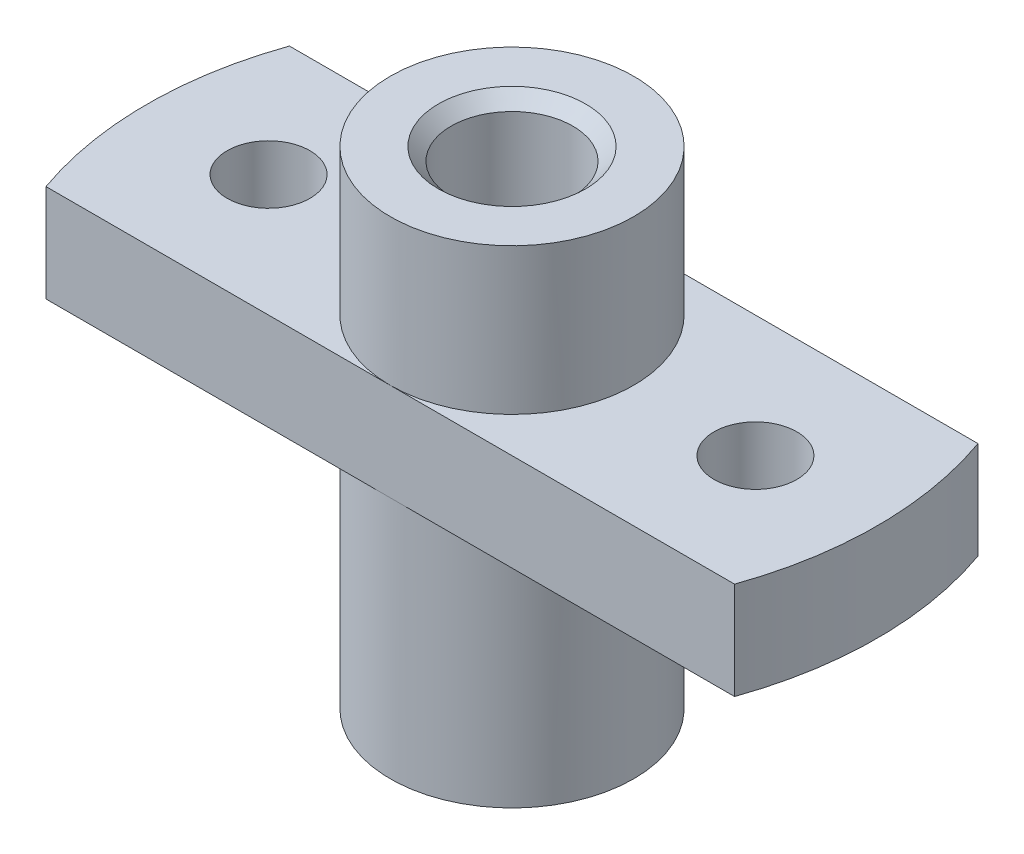
ISO-10303-21;
HEADER;
FILE_DESCRIPTION(('STEP AP214'),'2;1');
FILE_NAME('part.step','',(''),(''),'','','');
FILE_SCHEMA(('AUTOMOTIVE_DESIGN { 1 0 10303 214 1 1 1 1 }'));
ENDSEC;
DATA;
#1=APPLICATION_CONTEXT('core data for automotive mechanical design processes');
#2=APPLICATION_PROTOCOL_DEFINITION('international standard','automotive_design',2000,#1);
#3=PRODUCT_CONTEXT('',#1,'mechanical');
#4=PRODUCT('Part','Part','',(#3));
#5=PRODUCT_RELATED_PRODUCT_CATEGORY('part','',(#4));
#6=PRODUCT_DEFINITION_FORMATION('','',#4);
#7=PRODUCT_DEFINITION_CONTEXT('part definition',#1,'design');
#8=PRODUCT_DEFINITION('design','',#6,#7);
#9=PRODUCT_DEFINITION_SHAPE('','',#8);
#10=(LENGTH_UNIT() NAMED_UNIT(*) SI_UNIT(.MILLI.,.METRE.));
#11=(NAMED_UNIT(*) PLANE_ANGLE_UNIT() SI_UNIT($,.RADIAN.));
#12=(NAMED_UNIT(*) SI_UNIT($,.STERADIAN.) SOLID_ANGLE_UNIT());
#13=UNCERTAINTY_MEASURE_WITH_UNIT(LENGTH_MEASURE(1.E-05),#10,'distance_accuracy_value','');
#14=(GEOMETRIC_REPRESENTATION_CONTEXT(3) GLOBAL_UNCERTAINTY_ASSIGNED_CONTEXT((#13)) GLOBAL_UNIT_ASSIGNED_CONTEXT((#10,
#11,#12)) REPRESENTATION_CONTEXT('',''));
#15=CARTESIAN_POINT('',(0.,0.,0.));
#16=DIRECTION('',(0.,0.,1.));
#17=DIRECTION('',(1.,0.,0.));
#18=AXIS2_PLACEMENT_3D('',#15,#16,#17);
#19=CARTESIAN_POINT('',(-5.,10.,0.));
#20=DIRECTION('',(0.,-1.,0.));
#21=DIRECTION('',(1.,0.,0.));
#22=AXIS2_PLACEMENT_3D('',#19,#20,#21);
#23=PLANE('',#22);
#24=CARTESIAN_POINT('',(10.,10.,0.));
#25=DIRECTION('',(0.,-1.,0.));
#26=DIRECTION('',(1.,0.,0.));
#27=AXIS2_PLACEMENT_3D('',#24,#25,#26);
#28=CIRCLE('',#27,1.69999999999999);
#29=CARTESIAN_POINT('',(11.7,10.,0.));
#30=VERTEX_POINT('',#29);
#31=EDGE_CURVE('E290',#30,#30,#28,.T.);
#32=ORIENTED_EDGE('',*,*,#31,.F.);
#33=EDGE_LOOP('',(#32));
#34=FACE_BOUND('',#33,.T.);
#35=CARTESIAN_POINT('',(0.,10.,0.));
#36=DIRECTION('',(0.,1.,0.));
#37=DIRECTION('',(-1.,0.,0.));
#38=AXIS2_PLACEMENT_3D('',#35,#36,#37);
#39=CIRCLE('',#38,15.);
#40=CARTESIAN_POINT('',(14.142135623731,10.,5.));
#41=VERTEX_POINT('',#40);
#42=CARTESIAN_POINT('',(14.1421356237309,10.,-5.));
#43=VERTEX_POINT('',#42);
#44=EDGE_CURVE('E104',#41,#43,#39,.T.);
#45=ORIENTED_EDGE('',*,*,#44,.F.);
#46=DIRECTION('',(-1.,0.,0.));
#47=VECTOR('',#46,1.);
#48=CARTESIAN_POINT('',(-5.,10.,5.));
#49=LINE('',#48,#47);
#50=CARTESIAN_POINT('',(0.,10.,5.));
#51=VERTEX_POINT('',#50);
#52=EDGE_CURVE('E316',#41,#51,#49,.T.);
#53=ORIENTED_EDGE('',*,*,#52,.T.);
#54=CARTESIAN_POINT('',(0.,10.,0.));
#55=DIRECTION('',(0.,1.,0.));
#56=DIRECTION('',(-1.,0.,0.));
#57=AXIS2_PLACEMENT_3D('',#54,#55,#56);
#58=CIRCLE('',#57,5.);
#59=CARTESIAN_POINT('',(0.,10.,-5.));
#60=VERTEX_POINT('',#59);
#61=EDGE_CURVE('E40',#51,#60,#58,.T.);
#62=ORIENTED_EDGE('',*,*,#61,.T.);
#63=DIRECTION('',(1.,0.,0.));
#64=VECTOR('',#63,1.);
#65=CARTESIAN_POINT('',(-5.,10.,-5.));
#66=LINE('',#65,#64);
#67=EDGE_CURVE('E319',#60,#43,#66,.T.);
#68=ORIENTED_EDGE('',*,*,#67,.T.);
#69=EDGE_LOOP('',(#45,#53,#62,#68));
#70=FACE_BOUND('',#69,.T.);
#71=ADVANCED_FACE('F32',(#34,#70),#23,.T.);
#72=CARTESIAN_POINT('',(-10.,10.,0.));
#73=DIRECTION('',(0.,-1.,0.));
#74=DIRECTION('',(1.,0.,0.));
#75=AXIS2_PLACEMENT_3D('',#72,#73,#74);
#76=CIRCLE('',#75,1.69999999999999);
#77=CARTESIAN_POINT('',(-8.30000000000001,10.,0.));
#78=VERTEX_POINT('',#77);
#79=EDGE_CURVE('E297',#78,#78,#76,.T.);
#80=ORIENTED_EDGE('',*,*,#79,.F.);
#81=EDGE_LOOP('',(#80));
#82=FACE_BOUND('',#81,.T.);
#83=EDGE_CURVE('E111',#60,#51,#58,.T.);
#84=ORIENTED_EDGE('',*,*,#83,.T.);
#85=CARTESIAN_POINT('',(-14.1421356237309,10.,5.));
#86=VERTEX_POINT('',#85);
#87=EDGE_CURVE('E98',#51,#86,#49,.T.);
#88=ORIENTED_EDGE('',*,*,#87,.T.);
#89=CARTESIAN_POINT('',(-14.142135623731,10.,-5.));
#90=VERTEX_POINT('',#89);
#91=EDGE_CURVE('E97',#90,#86,#39,.T.);
#92=ORIENTED_EDGE('',*,*,#91,.F.);
#93=EDGE_CURVE('E123',#90,#60,#66,.T.);
#94=ORIENTED_EDGE('',*,*,#93,.T.);
#95=EDGE_LOOP('',(#84,#88,#92,#94));
#96=FACE_BOUND('',#95,.T.);
#97=ADVANCED_FACE('F121',(#82,#96),#23,.T.);
#98=CARTESIAN_POINT('',(0.,20.,0.));
#99=DIRECTION('',(0.,1.,0.));
#100=DIRECTION('',(-1.,0.,0.));
#101=AXIS2_PLACEMENT_3D('',#98,#99,#100);
#102=CYLINDRICAL_SURFACE('',#101,15.);
#103=ORIENTED_EDGE('',*,*,#44,.T.);
#104=DIRECTION('',(0.,1.,0.));
#105=VECTOR('',#104,1.);
#106=CARTESIAN_POINT('',(14.1421356237309,20.,-5.));
#107=LINE('',#106,#105);
#108=CARTESIAN_POINT('',(14.142135623731,14.,-5.));
#109=VERTEX_POINT('',#108);
#110=EDGE_CURVE('E93',#43,#109,#107,.T.);
#111=ORIENTED_EDGE('',*,*,#110,.T.);
#112=CARTESIAN_POINT('',(0.,14.,0.));
#113=DIRECTION('',(0.,1.,0.));
#114=DIRECTION('',(-1.,0.,0.));
#115=AXIS2_PLACEMENT_3D('',#112,#113,#114);
#116=CIRCLE('',#115,15.);
#117=CARTESIAN_POINT('',(14.142135623731,14.,5.));
#118=VERTEX_POINT('',#117);
#119=EDGE_CURVE('E105',#118,#109,#116,.T.);
#120=ORIENTED_EDGE('',*,*,#119,.F.);
#121=DIRECTION('',(0.,1.,0.));
#122=VECTOR('',#121,1.);
#123=CARTESIAN_POINT('',(14.1421356237309,20.,5.));
#124=LINE('',#123,#122);
#125=EDGE_CURVE('E55',#118,#41,#124,.F.);
#126=ORIENTED_EDGE('',*,*,#125,.T.);
#127=EDGE_LOOP('',(#103,#111,#120,#126));
#128=FACE_BOUND('',#127,.T.);
#129=ADVANCED_FACE('F145',(#128),#102,.T.);
#130=DIRECTION('',(0.,1.,0.));
#131=VECTOR('',#130,1.);
#132=CARTESIAN_POINT('',(-14.1421356237309,20.,-5.));
#133=LINE('',#132,#131);
#134=CARTESIAN_POINT('',(-14.142135623731,14.,-5.));
#135=VERTEX_POINT('',#134);
#136=EDGE_CURVE('E99',#135,#90,#133,.F.);
#137=ORIENTED_EDGE('',*,*,#136,.T.);
#138=ORIENTED_EDGE('',*,*,#91,.T.);
#139=DIRECTION('',(0.,1.,0.));
#140=VECTOR('',#139,1.);
#141=CARTESIAN_POINT('',(-14.1421356237309,20.,5.));
#142=LINE('',#141,#140);
#143=CARTESIAN_POINT('',(-14.142135623731,14.,5.));
#144=VERTEX_POINT('',#143);
#145=EDGE_CURVE('E87',#86,#144,#142,.T.);
#146=ORIENTED_EDGE('',*,*,#145,.T.);
#147=EDGE_CURVE('E47',#135,#144,#116,.T.);
#148=ORIENTED_EDGE('',*,*,#147,.F.);
#149=EDGE_LOOP('',(#137,#138,#146,#148));
#150=FACE_BOUND('',#149,.T.);
#151=ADVANCED_FACE('F96',(#150),#102,.T.);
#152=CARTESIAN_POINT('',(-15.,14.,0.));
#153=DIRECTION('',(0.,1.,0.));
#154=DIRECTION('',(-1.,0.,0.));
#155=AXIS2_PLACEMENT_3D('',#152,#153,#154);
#156=PLANE('',#155);
#157=CARTESIAN_POINT('',(-10.,14.,0.));
#158=DIRECTION('',(0.,1.,0.));
#159=DIRECTION('',(0.,0.,1.));
#160=AXIS2_PLACEMENT_3D('',#157,#158,#159);
#161=CIRCLE('',#160,1.69999999999999);
#162=CARTESIAN_POINT('',(-10.,14.,1.69999999999999));
#163=VERTEX_POINT('',#162);
#164=EDGE_CURVE('E300',#163,#163,#161,.T.);
#165=ORIENTED_EDGE('',*,*,#164,.F.);
#166=EDGE_LOOP('',(#165));
#167=FACE_BOUND('',#166,.T.);
#168=ORIENTED_EDGE('',*,*,#147,.T.);
#169=DIRECTION('',(1.,0.,0.));
#170=VECTOR('',#169,1.);
#171=CARTESIAN_POINT('',(-15.,14.,5.));
#172=LINE('',#171,#170);
#173=CARTESIAN_POINT('',(0.,14.,5.));
#174=VERTEX_POINT('',#173);
#175=EDGE_CURVE('E85',#144,#174,#172,.T.);
#176=ORIENTED_EDGE('',*,*,#175,.T.);
#177=CARTESIAN_POINT('',(0.,14.,0.));
#178=DIRECTION('',(0.,1.,0.));
#179=DIRECTION('',(-1.,0.,0.));
#180=AXIS2_PLACEMENT_3D('',#177,#178,#179);
#181=CIRCLE('',#180,5.);
#182=CARTESIAN_POINT('',(0.,14.,-5.));
#183=VERTEX_POINT('',#182);
#184=EDGE_CURVE('E287',#183,#174,#181,.T.);
#185=ORIENTED_EDGE('',*,*,#184,.F.);
#186=DIRECTION('',(-1.,0.,0.));
#187=VECTOR('',#186,1.);
#188=CARTESIAN_POINT('',(-15.,14.,-5.));
#189=LINE('',#188,#187);
#190=EDGE_CURVE('E103',#183,#135,#189,.T.);
#191=ORIENTED_EDGE('',*,*,#190,.T.);
#192=EDGE_LOOP('',(#168,#176,#185,#191));
#193=FACE_BOUND('',#192,.T.);
#194=ADVANCED_FACE('F102',(#167,#193),#156,.T.);
#195=CARTESIAN_POINT('',(10.,14.,0.));
#196=DIRECTION('',(0.,1.,0.));
#197=DIRECTION('',(0.,0.,1.));
#198=AXIS2_PLACEMENT_3D('',#195,#196,#197);
#199=CIRCLE('',#198,1.69999999999999);
#200=CARTESIAN_POINT('',(10.,14.,1.69999999999999));
#201=VERTEX_POINT('',#200);
#202=EDGE_CURVE('E280',#201,#201,#199,.T.);
#203=ORIENTED_EDGE('',*,*,#202,.F.);
#204=EDGE_LOOP('',(#203));
#205=FACE_BOUND('',#204,.T.);
#206=EDGE_CURVE('E108',#174,#183,#181,.T.);
#207=ORIENTED_EDGE('',*,*,#206,.F.);
#208=EDGE_CURVE('E89',#174,#118,#172,.T.);
#209=ORIENTED_EDGE('',*,*,#208,.T.);
#210=ORIENTED_EDGE('',*,*,#119,.T.);
#211=EDGE_CURVE('E286',#109,#183,#189,.T.);
#212=ORIENTED_EDGE('',*,*,#211,.T.);
#213=EDGE_LOOP('',(#207,#209,#210,#212));
#214=FACE_BOUND('',#213,.T.);
#215=ADVANCED_FACE('F136',(#205,#214),#156,.T.);
#216=CARTESIAN_POINT('',(0.,0.,0.));
#217=DIRECTION('',(0.,-1.,0.));
#218=DIRECTION('',(1.,0.,0.));
#219=AXIS2_PLACEMENT_3D('',#216,#217,#218);
#220=PLANE('',#219);
#221=CARTESIAN_POINT('',(0.,0.,0.));
#222=DIRECTION('',(0.,1.,0.));
#223=DIRECTION('',(0.,0.,1.));
#224=AXIS2_PLACEMENT_3D('',#221,#222,#223);
#225=CIRCLE('',#224,3.025);
#226=CARTESIAN_POINT('',(0.,0.,3.025));
#227=VERTEX_POINT('',#226);
#228=EDGE_CURVE('E312',#227,#227,#225,.T.);
#229=ORIENTED_EDGE('',*,*,#228,.T.);
#230=EDGE_LOOP('',(#229));
#231=FACE_BOUND('',#230,.T.);
#232=CARTESIAN_POINT('',(0.,0.,0.));
#233=DIRECTION('',(0.,1.,0.));
#234=DIRECTION('',(-1.,0.,0.));
#235=AXIS2_PLACEMENT_3D('',#232,#233,#234);
#236=CIRCLE('',#235,5.);
#237=CARTESIAN_POINT('',(-5.,0.,0.));
#238=VERTEX_POINT('',#237);
#239=EDGE_CURVE('E12',#238,#238,#236,.T.);
#240=ORIENTED_EDGE('',*,*,#239,.F.);
#241=EDGE_LOOP('',(#240));
#242=FACE_BOUND('',#241,.T.);
#243=ADVANCED_FACE('F34',(#231,#242),#220,.T.);
#244=CARTESIAN_POINT('',(0.,20.,0.));
#245=DIRECTION('',(0.,1.,0.));
#246=DIRECTION('',(-1.,0.,0.));
#247=AXIS2_PLACEMENT_3D('',#244,#245,#246);
#248=CYLINDRICAL_SURFACE('',#247,5.);
#249=ORIENTED_EDGE('',*,*,#239,.T.);
#250=EDGE_LOOP('',(#249));
#251=FACE_BOUND('',#250,.T.);
#252=ORIENTED_EDGE('',*,*,#61,.F.);
#253=ORIENTED_EDGE('',*,*,#83,.F.);
#254=EDGE_LOOP('',(#252,#253));
#255=FACE_BOUND('',#254,.T.);
#256=ADVANCED_FACE('F125',(#251,#255),#248,.T.);
#257=CARTESIAN_POINT('',(0.,20.,0.));
#258=DIRECTION('',(0.,1.,0.));
#259=DIRECTION('',(-1.,0.,0.));
#260=AXIS2_PLACEMENT_3D('',#257,#258,#259);
#261=CYLINDRICAL_SURFACE('',#260,5.);
#262=ORIENTED_EDGE('',*,*,#206,.T.);
#263=ORIENTED_EDGE('',*,*,#184,.T.);
#264=EDGE_LOOP('',(#262,#263));
#265=FACE_BOUND('',#264,.T.);
#266=CARTESIAN_POINT('',(0.,20.,0.));
#267=DIRECTION('',(0.,1.,0.));
#268=DIRECTION('',(-1.,0.,0.));
#269=AXIS2_PLACEMENT_3D('',#266,#267,#268);
#270=CIRCLE('',#269,5.);
#271=CARTESIAN_POINT('',(-5.,20.,0.));
#272=VERTEX_POINT('',#271);
#273=EDGE_CURVE('E288',#272,#272,#270,.T.);
#274=ORIENTED_EDGE('',*,*,#273,.F.);
#275=EDGE_LOOP('',(#274));
#276=FACE_BOUND('',#275,.T.);
#277=ADVANCED_FACE('F127',(#265,#276),#261,.T.);
#278=CARTESIAN_POINT('',(-5.,20.,0.));
#279=DIRECTION('',(0.,1.,0.));
#280=DIRECTION('',(-1.,0.,0.));
#281=AXIS2_PLACEMENT_3D('',#278,#279,#280);
#282=PLANE('',#281);
#283=CARTESIAN_POINT('',(0.,20.,0.));
#284=DIRECTION('',(0.,1.,0.));
#285=DIRECTION('',(0.,0.,1.));
#286=AXIS2_PLACEMENT_3D('',#283,#284,#285);
#287=CIRCLE('',#286,3.025);
#288=CARTESIAN_POINT('',(0.,20.,3.025));
#289=VERTEX_POINT('',#288);
#290=EDGE_CURVE('E309',#289,#289,#287,.T.);
#291=ORIENTED_EDGE('',*,*,#290,.F.);
#292=EDGE_LOOP('',(#291));
#293=FACE_BOUND('',#292,.T.);
#294=ORIENTED_EDGE('',*,*,#273,.T.);
#295=EDGE_LOOP('',(#294));
#296=FACE_BOUND('',#295,.T.);
#297=ADVANCED_FACE('F133',(#293,#296),#282,.T.);
#298=CARTESIAN_POINT('',(10.,14.,0.));
#299=DIRECTION('',(0.,1.,0.));
#300=DIRECTION('',(0.,0.,1.));
#301=AXIS2_PLACEMENT_3D('',#298,#299,#300);
#302=CYLINDRICAL_SURFACE('',#301,1.69999999999999);
#303=ORIENTED_EDGE('',*,*,#202,.T.);
#304=EDGE_LOOP('',(#303));
#305=FACE_BOUND('',#304,.T.);
#306=ORIENTED_EDGE('',*,*,#31,.T.);
#307=EDGE_LOOP('',(#306));
#308=FACE_BOUND('',#307,.T.);
#309=ADVANCED_FACE('F157',(#305,#308),#302,.F.);
#310=CARTESIAN_POINT('',(-10.,14.,0.));
#311=DIRECTION('',(0.,1.,0.));
#312=DIRECTION('',(0.,0.,1.));
#313=AXIS2_PLACEMENT_3D('',#310,#311,#312);
#314=CYLINDRICAL_SURFACE('',#313,1.69999999999999);
#315=ORIENTED_EDGE('',*,*,#164,.T.);
#316=EDGE_LOOP('',(#315));
#317=FACE_BOUND('',#316,.T.);
#318=ORIENTED_EDGE('',*,*,#79,.T.);
#319=EDGE_LOOP('',(#318));
#320=FACE_BOUND('',#319,.T.);
#321=ADVANCED_FACE('F161',(#317,#320),#314,.F.);
#322=CARTESIAN_POINT('',(0.,0.525000000000001,0.));
#323=DIRECTION('',(0.,-1.,0.));
#324=DIRECTION('',(0.,0.,-1.));
#325=AXIS2_PLACEMENT_3D('',#322,#323,#324);
#326=CONICAL_SURFACE('',#325,2.5,0.785398163397447);
#327=ORIENTED_EDGE('',*,*,#228,.F.);
#328=EDGE_LOOP('',(#327));
#329=FACE_BOUND('',#328,.T.);
#330=CARTESIAN_POINT('',(0.,0.525000000000001,0.));
#331=DIRECTION('',(0.,1.,0.));
#332=DIRECTION('',(0.,0.,1.));
#333=AXIS2_PLACEMENT_3D('',#330,#331,#332);
#334=CIRCLE('',#333,2.5);
#335=CARTESIAN_POINT('',(0.,0.525000000000001,2.5));
#336=VERTEX_POINT('',#335);
#337=EDGE_CURVE('E303',#336,#336,#334,.T.);
#338=ORIENTED_EDGE('',*,*,#337,.T.);
#339=EDGE_LOOP('',(#338));
#340=FACE_BOUND('',#339,.T.);
#341=ADVANCED_FACE('F165',(#329,#340),#326,.F.);
#342=CARTESIAN_POINT('',(0.,20.,0.));
#343=DIRECTION('',(0.,1.,0.));
#344=DIRECTION('',(0.,0.,1.));
#345=AXIS2_PLACEMENT_3D('',#342,#343,#344);
#346=CYLINDRICAL_SURFACE('',#345,2.5);
#347=ORIENTED_EDGE('',*,*,#337,.F.);
#348=EDGE_LOOP('',(#347));
#349=FACE_BOUND('',#348,.T.);
#350=CARTESIAN_POINT('',(0.,19.475,0.));
#351=DIRECTION('',(0.,1.,0.));
#352=DIRECTION('',(0.,0.,1.));
#353=AXIS2_PLACEMENT_3D('',#350,#351,#352);
#354=CIRCLE('',#353,2.5);
#355=CARTESIAN_POINT('',(0.,19.475,2.5));
#356=VERTEX_POINT('',#355);
#357=EDGE_CURVE('E306',#356,#356,#354,.T.);
#358=ORIENTED_EDGE('',*,*,#357,.T.);
#359=EDGE_LOOP('',(#358));
#360=FACE_BOUND('',#359,.T.);
#361=ADVANCED_FACE('F169',(#349,#360),#346,.F.);
#362=CARTESIAN_POINT('',(0.,20.,0.));
#363=DIRECTION('',(0.,1.,0.));
#364=DIRECTION('',(0.,0.,1.));
#365=AXIS2_PLACEMENT_3D('',#362,#363,#364);
#366=CONICAL_SURFACE('',#365,3.025,0.785398163397449);
#367=ORIENTED_EDGE('',*,*,#357,.F.);
#368=EDGE_LOOP('',(#367));
#369=FACE_BOUND('',#368,.T.);
#370=ORIENTED_EDGE('',*,*,#290,.T.);
#371=EDGE_LOOP('',(#370));
#372=FACE_BOUND('',#371,.T.);
#373=ADVANCED_FACE('F173',(#369,#372),#366,.F.);
#374=CARTESIAN_POINT('',(-15.,0.,-5.));
#375=DIRECTION('',(0.,0.,-1.));
#376=DIRECTION('',(-1.,0.,0.));
#377=AXIS2_PLACEMENT_3D('',#374,#375,#376);
#378=PLANE('',#377);
#379=ORIENTED_EDGE('',*,*,#190,.F.);
#380=ORIENTED_EDGE('',*,*,#211,.F.);
#381=ORIENTED_EDGE('',*,*,#110,.F.);
#382=ORIENTED_EDGE('',*,*,#67,.F.);
#383=ORIENTED_EDGE('',*,*,#93,.F.);
#384=ORIENTED_EDGE('',*,*,#136,.F.);
#385=EDGE_LOOP('',(#379,#380,#381,#382,#383,#384));
#386=FACE_BOUND('',#385,.T.);
#387=ADVANCED_FACE('F177',(#386),#378,.T.);
#388=CARTESIAN_POINT('',(-15.,0.,5.));
#389=DIRECTION('',(0.,0.,1.));
#390=DIRECTION('',(1.,0.,0.));
#391=AXIS2_PLACEMENT_3D('',#388,#389,#390);
#392=PLANE('',#391);
#393=ORIENTED_EDGE('',*,*,#208,.F.);
#394=ORIENTED_EDGE('',*,*,#175,.F.);
#395=ORIENTED_EDGE('',*,*,#145,.F.);
#396=ORIENTED_EDGE('',*,*,#87,.F.);
#397=ORIENTED_EDGE('',*,*,#52,.F.);
#398=ORIENTED_EDGE('',*,*,#125,.F.);
#399=EDGE_LOOP('',(#393,#394,#395,#396,#397,#398));
#400=FACE_BOUND('',#399,.T.);
#401=ADVANCED_FACE('F86',(#400),#392,.T.);
#402=CLOSED_SHELL('',(#71,#97,#129,#151,#194,#215,#243,#256,#277,#297,#309,#321,#341,#361,#373,
#387,#401));
#403=MANIFOLD_SOLID_BREP('B2',#402);
#404=ADVANCED_BREP_SHAPE_REPRESENTATION('',(#18,#403),#14);
#405=SHAPE_DEFINITION_REPRESENTATION(#9,#404);
ENDSEC;
END-ISO-10303-21;
